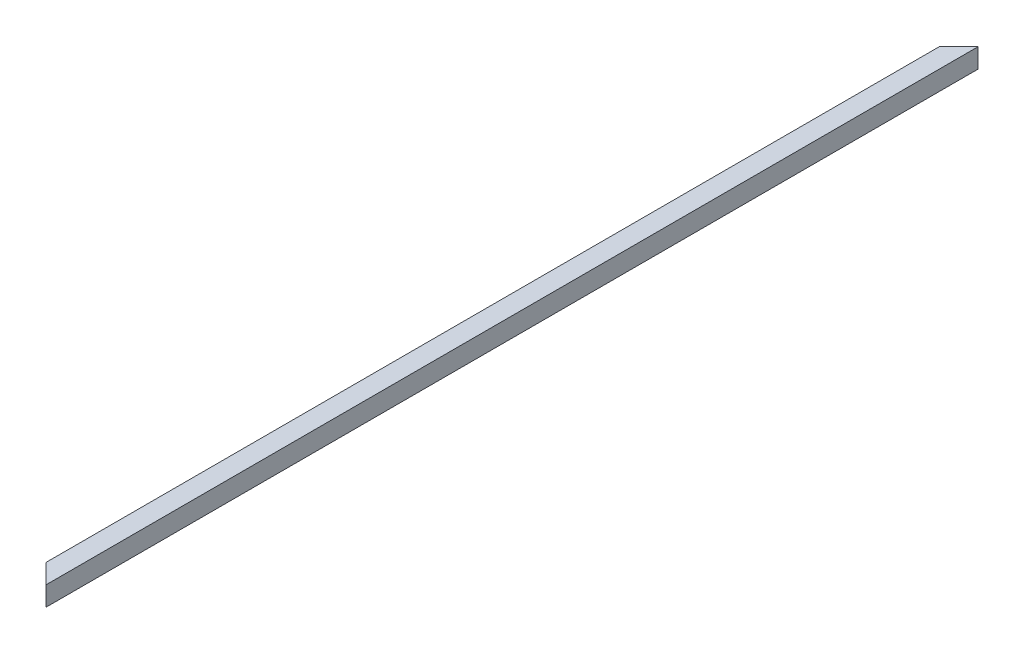
ISO-10303-21;
HEADER;
FILE_DESCRIPTION(('STEP AP214'),'2;1');
FILE_NAME('part.step','',(''),(''),'','','');
FILE_SCHEMA(('AUTOMOTIVE_DESIGN { 1 0 10303 214 1 1 1 1 }'));
ENDSEC;
DATA;
#1=APPLICATION_CONTEXT('core data for automotive mechanical design processes');
#2=APPLICATION_PROTOCOL_DEFINITION('international standard','automotive_design',2000,#1);
#3=PRODUCT_CONTEXT('',#1,'mechanical');
#4=PRODUCT('Part','Part','',(#3));
#5=PRODUCT_RELATED_PRODUCT_CATEGORY('part','',(#4));
#6=PRODUCT_DEFINITION_FORMATION('','',#4);
#7=PRODUCT_DEFINITION_CONTEXT('part definition',#1,'design');
#8=PRODUCT_DEFINITION('design','',#6,#7);
#9=PRODUCT_DEFINITION_SHAPE('','',#8);
#10=(LENGTH_UNIT() NAMED_UNIT(*) SI_UNIT(.MILLI.,.METRE.));
#11=(NAMED_UNIT(*) PLANE_ANGLE_UNIT() SI_UNIT($,.RADIAN.));
#12=(NAMED_UNIT(*) SI_UNIT($,.STERADIAN.) SOLID_ANGLE_UNIT());
#13=UNCERTAINTY_MEASURE_WITH_UNIT(LENGTH_MEASURE(1.E-05),#10,'distance_accuracy_value','');
#14=(GEOMETRIC_REPRESENTATION_CONTEXT(3) GLOBAL_UNCERTAINTY_ASSIGNED_CONTEXT((#13)) GLOBAL_UNIT_ASSIGNED_CONTEXT((#10,
#11,#12)) REPRESENTATION_CONTEXT('',''));
#15=CARTESIAN_POINT('',(0.,0.,0.));
#16=DIRECTION('',(0.,0.,1.));
#17=DIRECTION('',(1.,0.,0.));
#18=AXIS2_PLACEMENT_3D('',#15,#16,#17);
#19=CARTESIAN_POINT('',(-25.4,0.,1219.2));
#20=DIRECTION('',(0.,-1.,0.));
#21=DIRECTION('',(0.,0.,-1.));
#22=AXIS2_PLACEMENT_3D('',#19,#20,#21);
#23=PLANE('',#22);
#24=DIRECTION('',(0.,0.,-1.));
#25=VECTOR('',#24,1.);
#26=CARTESIAN_POINT('',(0.,0.,1219.2));
#27=LINE('',#26,#25);
#28=CARTESIAN_POINT('',(0.,0.,1219.2));
#29=VERTEX_POINT('',#28);
#30=CARTESIAN_POINT('',(0.,0.,0.));
#31=VERTEX_POINT('',#30);
#32=EDGE_CURVE('E103',#29,#31,#27,.T.);
#33=ORIENTED_EDGE('',*,*,#32,.T.);
#34=DIRECTION('',(-0.707106781186549,0.,0.707106781186546));
#35=VECTOR('',#34,1.);
#36=CARTESIAN_POINT('',(-25.4,0.,25.3999999999999));
#37=LINE('',#36,#35);
#38=CARTESIAN_POINT('',(-25.4,0.,25.4000000000003));
#39=VERTEX_POINT('',#38);
#40=EDGE_CURVE('E11',#31,#39,#37,.T.);
#41=ORIENTED_EDGE('',*,*,#40,.T.);
#42=DIRECTION('',(0.,0.,-1.));
#43=VECTOR('',#42,1.);
#44=CARTESIAN_POINT('',(-25.4,0.,1219.2));
#45=LINE('',#44,#43);
#46=CARTESIAN_POINT('',(-25.4,0.,1193.8));
#47=VERTEX_POINT('',#46);
#48=EDGE_CURVE('E119',#47,#39,#45,.T.);
#49=ORIENTED_EDGE('',*,*,#48,.F.);
#50=DIRECTION('',(-0.707106781186543,0.,-0.707106781186552));
#51=VECTOR('',#50,1.);
#52=CARTESIAN_POINT('',(0.,0.,1219.2));
#53=LINE('',#52,#51);
#54=EDGE_CURVE('E44',#47,#29,#53,.F.);
#55=ORIENTED_EDGE('',*,*,#54,.T.);
#56=EDGE_LOOP('',(#33,#41,#49,#55));
#57=FACE_BOUND('',#56,.T.);
#58=ADVANCED_FACE('F35',(#57),#23,.F.);
#59=CARTESIAN_POINT('',(-25.4,-6.35,1219.2));
#60=DIRECTION('',(1.,0.,0.));
#61=DIRECTION('',(0.,1.,0.));
#62=AXIS2_PLACEMENT_3D('',#59,#60,#61);
#63=PLANE('',#62);
#64=ORIENTED_EDGE('',*,*,#48,.T.);
#65=DIRECTION('',(0.,-1.,0.));
#66=VECTOR('',#65,1.);
#67=CARTESIAN_POINT('',(-25.4,-6.35,25.3999999999999));
#68=LINE('',#67,#66);
#69=CARTESIAN_POINT('',(-25.4,-6.35,25.4000000000003));
#70=VERTEX_POINT('',#69);
#71=EDGE_CURVE('E124',#39,#70,#68,.T.);
#72=ORIENTED_EDGE('',*,*,#71,.T.);
#73=DIRECTION('',(0.,0.,-1.));
#74=VECTOR('',#73,1.);
#75=CARTESIAN_POINT('',(-25.4,-6.35,1219.2));
#76=LINE('',#75,#74);
#77=CARTESIAN_POINT('',(-25.4,-6.35,1193.8));
#78=VERTEX_POINT('',#77);
#79=EDGE_CURVE('E116',#78,#70,#76,.T.);
#80=ORIENTED_EDGE('',*,*,#79,.F.);
#81=DIRECTION('',(0.,1.,0.));
#82=VECTOR('',#81,1.);
#83=CARTESIAN_POINT('',(-25.4,-6.35,1193.8));
#84=LINE('',#83,#82);
#85=EDGE_CURVE('E122',#78,#47,#84,.T.);
#86=ORIENTED_EDGE('',*,*,#85,.T.);
#87=EDGE_LOOP('',(#64,#72,#80,#86));
#88=FACE_BOUND('',#87,.T.);
#89=ADVANCED_FACE('F139',(#88),#63,.F.);
#90=CARTESIAN_POINT('',(-6.35,-6.35,1219.2));
#91=DIRECTION('',(0.,1.,0.));
#92=DIRECTION('',(-1.,0.,0.));
#93=AXIS2_PLACEMENT_3D('',#90,#91,#92);
#94=PLANE('',#93);
#95=ORIENTED_EDGE('',*,*,#79,.T.);
#96=DIRECTION('',(0.707106781186549,0.,-0.707106781186546));
#97=VECTOR('',#96,1.);
#98=CARTESIAN_POINT('',(-25.4,-6.35,25.3999999999999));
#99=LINE('',#98,#97);
#100=CARTESIAN_POINT('',(-6.35,-6.35,6.3500000000003));
#101=VERTEX_POINT('',#100);
#102=EDGE_CURVE('E129',#70,#101,#99,.T.);
#103=ORIENTED_EDGE('',*,*,#102,.T.);
#104=DIRECTION('',(0.,0.,-1.));
#105=VECTOR('',#104,1.);
#106=CARTESIAN_POINT('',(-6.35,-6.35,1219.2));
#107=LINE('',#106,#105);
#108=CARTESIAN_POINT('',(-6.35,-6.35,1212.85));
#109=VERTEX_POINT('',#108);
#110=EDGE_CURVE('E114',#109,#101,#107,.T.);
#111=ORIENTED_EDGE('',*,*,#110,.F.);
#112=DIRECTION('',(0.707106781186543,0.,0.707106781186552));
#113=VECTOR('',#112,1.);
#114=CARTESIAN_POINT('',(0.,-6.35,1219.2));
#115=LINE('',#114,#113);
#116=EDGE_CURVE('E127',#109,#78,#115,.F.);
#117=ORIENTED_EDGE('',*,*,#116,.T.);
#118=EDGE_LOOP('',(#95,#103,#111,#117));
#119=FACE_BOUND('',#118,.T.);
#120=ADVANCED_FACE('F142',(#119),#94,.F.);
#121=CARTESIAN_POINT('',(-6.35,-25.4,1219.2));
#122=DIRECTION('',(1.,0.,0.));
#123=DIRECTION('',(0.,0.,-1.));
#124=AXIS2_PLACEMENT_3D('',#121,#122,#123);
#125=PLANE('',#124);
#126=ORIENTED_EDGE('',*,*,#110,.T.);
#127=DIRECTION('',(0.,-1.,0.));
#128=VECTOR('',#127,1.);
#129=CARTESIAN_POINT('',(-6.35,-6.35000000000001,6.34999999999997));
#130=LINE('',#129,#128);
#131=CARTESIAN_POINT('',(-6.35,-25.4,6.3500000000003));
#132=VERTEX_POINT('',#131);
#133=EDGE_CURVE('E51',#101,#132,#130,.T.);
#134=ORIENTED_EDGE('',*,*,#133,.T.);
#135=DIRECTION('',(0.,0.,-1.));
#136=VECTOR('',#135,1.);
#137=CARTESIAN_POINT('',(-6.35,-25.4,1219.2));
#138=LINE('',#137,#136);
#139=CARTESIAN_POINT('',(-6.35,-25.4,1212.85));
#140=VERTEX_POINT('',#139);
#141=EDGE_CURVE('E102',#140,#132,#138,.T.);
#142=ORIENTED_EDGE('',*,*,#141,.F.);
#143=DIRECTION('',(0.,-1.,0.));
#144=VECTOR('',#143,1.);
#145=CARTESIAN_POINT('',(-6.35,0.,1212.85));
#146=LINE('',#145,#144);
#147=EDGE_CURVE('E93',#140,#109,#146,.F.);
#148=ORIENTED_EDGE('',*,*,#147,.T.);
#149=EDGE_LOOP('',(#126,#134,#142,#148));
#150=FACE_BOUND('',#149,.T.);
#151=ADVANCED_FACE('F144',(#150),#125,.F.);
#152=CARTESIAN_POINT('',(0.,-25.4,1219.2));
#153=DIRECTION('',(0.,1.,0.));
#154=DIRECTION('',(-1.,0.,0.));
#155=AXIS2_PLACEMENT_3D('',#152,#153,#154);
#156=PLANE('',#155);
#157=ORIENTED_EDGE('',*,*,#141,.T.);
#158=DIRECTION('',(0.707106781186549,0.,-0.707106781186546));
#159=VECTOR('',#158,1.);
#160=CARTESIAN_POINT('',(-25.4,-25.4,25.3999999999999));
#161=LINE('',#160,#159);
#162=CARTESIAN_POINT('',(0.,-25.4,0.));
#163=VERTEX_POINT('',#162);
#164=EDGE_CURVE('E94',#132,#163,#161,.T.);
#165=ORIENTED_EDGE('',*,*,#164,.T.);
#166=DIRECTION('',(0.,0.,-1.));
#167=VECTOR('',#166,1.);
#168=CARTESIAN_POINT('',(0.,-25.4,1219.2));
#169=LINE('',#168,#167);
#170=CARTESIAN_POINT('',(0.,-25.4,1219.2));
#171=VERTEX_POINT('',#170);
#172=EDGE_CURVE('E97',#171,#163,#169,.T.);
#173=ORIENTED_EDGE('',*,*,#172,.F.);
#174=DIRECTION('',(0.707106781186543,0.,0.707106781186552));
#175=VECTOR('',#174,1.);
#176=CARTESIAN_POINT('',(0.,-25.4,1219.2));
#177=LINE('',#176,#175);
#178=EDGE_CURVE('E58',#171,#140,#177,.F.);
#179=ORIENTED_EDGE('',*,*,#178,.T.);
#180=EDGE_LOOP('',(#157,#165,#173,#179));
#181=FACE_BOUND('',#180,.T.);
#182=ADVANCED_FACE('F98',(#181),#156,.F.);
#183=CARTESIAN_POINT('',(0.,0.,1219.2));
#184=DIRECTION('',(-1.,0.,0.));
#185=DIRECTION('',(0.,-1.,0.));
#186=AXIS2_PLACEMENT_3D('',#183,#184,#185);
#187=PLANE('',#186);
#188=DIRECTION('',(0.,1.,0.));
#189=VECTOR('',#188,1.);
#190=CARTESIAN_POINT('',(0.,0.,0.));
#191=LINE('',#190,#189);
#192=EDGE_CURVE('E108',#163,#31,#191,.T.);
#193=ORIENTED_EDGE('',*,*,#192,.T.);
#194=ORIENTED_EDGE('',*,*,#32,.F.);
#195=DIRECTION('',(0.,1.,0.));
#196=VECTOR('',#195,1.);
#197=CARTESIAN_POINT('',(0.,0.,1219.2));
#198=LINE('',#197,#196);
#199=EDGE_CURVE('E91',#171,#29,#198,.T.);
#200=ORIENTED_EDGE('',*,*,#199,.F.);
#201=ORIENTED_EDGE('',*,*,#172,.T.);
#202=EDGE_LOOP('',(#193,#194,#200,#201));
#203=FACE_BOUND('',#202,.T.);
#204=ADVANCED_FACE('F106',(#203),#187,.F.);
#205=CARTESIAN_POINT('',(-25.4,-6.35,25.3999999999999));
#206=DIRECTION('',(-0.707106781186546,0.,-0.707106781186549));
#207=DIRECTION('',(0.,1.,0.));
#208=AXIS2_PLACEMENT_3D('',#205,#206,#207);
#209=PLANE('',#208);
#210=ORIENTED_EDGE('',*,*,#40,.F.);
#211=ORIENTED_EDGE('',*,*,#192,.F.);
#212=ORIENTED_EDGE('',*,*,#164,.F.);
#213=ORIENTED_EDGE('',*,*,#133,.F.);
#214=ORIENTED_EDGE('',*,*,#102,.F.);
#215=ORIENTED_EDGE('',*,*,#71,.F.);
#216=EDGE_LOOP('',(#210,#211,#212,#213,#214,#215));
#217=FACE_BOUND('',#216,.T.);
#218=ADVANCED_FACE('F146',(#217),#209,.T.);
#219=CARTESIAN_POINT('',(0.,0.,1219.2));
#220=DIRECTION('',(0.707106781186552,0.,-0.707106781186543));
#221=DIRECTION('',(0.,-1.,0.));
#222=AXIS2_PLACEMENT_3D('',#219,#220,#221);
#223=PLANE('',#222);
#224=ORIENTED_EDGE('',*,*,#54,.F.);
#225=ORIENTED_EDGE('',*,*,#85,.F.);
#226=ORIENTED_EDGE('',*,*,#116,.F.);
#227=ORIENTED_EDGE('',*,*,#147,.F.);
#228=ORIENTED_EDGE('',*,*,#178,.F.);
#229=ORIENTED_EDGE('',*,*,#199,.T.);
#230=EDGE_LOOP('',(#224,#225,#226,#227,#228,#229));
#231=FACE_BOUND('',#230,.T.);
#232=ADVANCED_FACE('F38',(#231),#223,.F.);
#233=CLOSED_SHELL('',(#58,#89,#120,#151,#182,#204,#218,#232));
#234=MANIFOLD_SOLID_BREP('B2',#233);
#235=ADVANCED_BREP_SHAPE_REPRESENTATION('',(#18,#234),#14);
#236=SHAPE_DEFINITION_REPRESENTATION(#9,#235);
ENDSEC;
END-ISO-10303-21;
